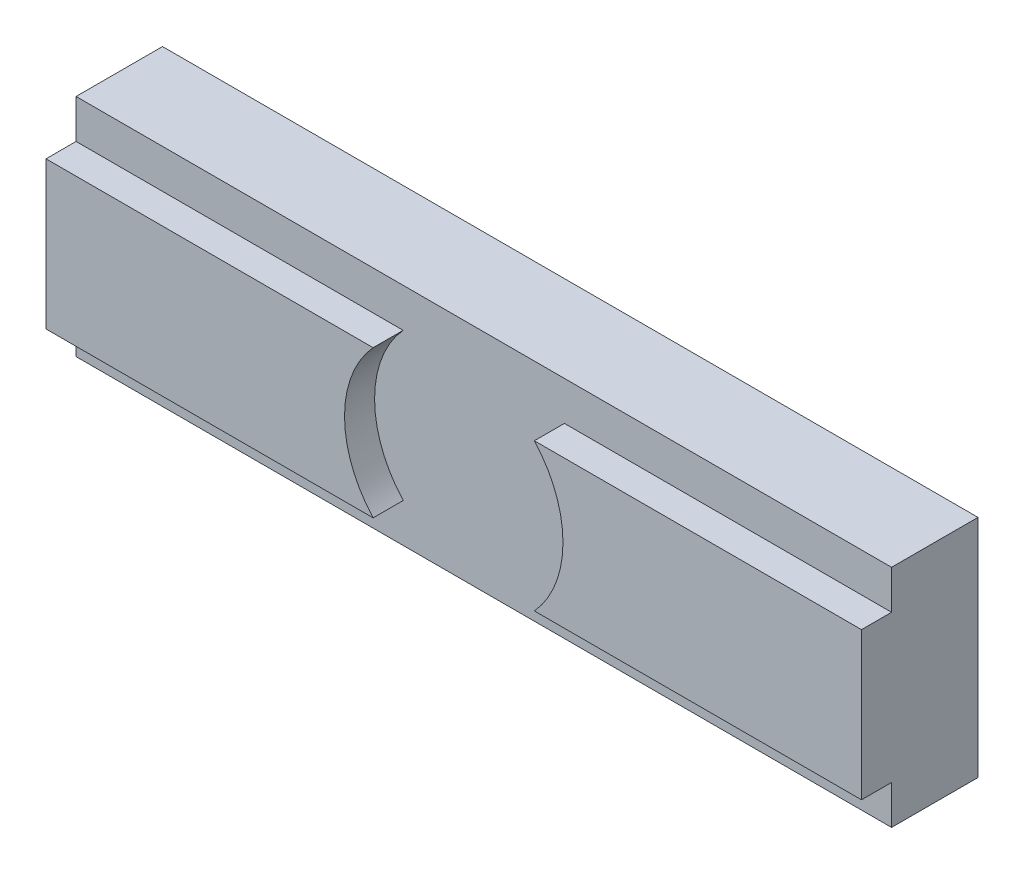
ISO-10303-21;
HEADER;
FILE_DESCRIPTION(('STEP AP214'),'2;1');
FILE_NAME('part.step','',(''),(''),'','','');
FILE_SCHEMA(('AUTOMOTIVE_DESIGN { 1 0 10303 214 1 1 1 1 }'));
ENDSEC;
DATA;
#1=APPLICATION_CONTEXT('core data for automotive mechanical design processes');
#2=APPLICATION_PROTOCOL_DEFINITION('international standard','automotive_design',2000,#1);
#3=PRODUCT_CONTEXT('',#1,'mechanical');
#4=PRODUCT('Part','Part','',(#3));
#5=PRODUCT_RELATED_PRODUCT_CATEGORY('part','',(#4));
#6=PRODUCT_DEFINITION_FORMATION('','',#4);
#7=PRODUCT_DEFINITION_CONTEXT('part definition',#1,'design');
#8=PRODUCT_DEFINITION('design','',#6,#7);
#9=PRODUCT_DEFINITION_SHAPE('','',#8);
#10=(LENGTH_UNIT() NAMED_UNIT(*) SI_UNIT(.MILLI.,.METRE.));
#11=(NAMED_UNIT(*) PLANE_ANGLE_UNIT() SI_UNIT($,.RADIAN.));
#12=(NAMED_UNIT(*) SI_UNIT($,.STERADIAN.) SOLID_ANGLE_UNIT());
#13=UNCERTAINTY_MEASURE_WITH_UNIT(LENGTH_MEASURE(1.E-05),#10,'distance_accuracy_value','');
#14=(GEOMETRIC_REPRESENTATION_CONTEXT(3) GLOBAL_UNCERTAINTY_ASSIGNED_CONTEXT((#13)) GLOBAL_UNIT_ASSIGNED_CONTEXT((#10,
#11,#12)) REPRESENTATION_CONTEXT('',''));
#15=CARTESIAN_POINT('',(0.,0.,0.));
#16=DIRECTION('',(0.,0.,1.));
#17=DIRECTION('',(1.,0.,0.));
#18=AXIS2_PLACEMENT_3D('',#15,#16,#17);
#19=CARTESIAN_POINT('',(140.,-12.6506155685339,0.));
#20=DIRECTION('',(0.,1.,0.));
#21=DIRECTION('',(0.,0.,1.));
#22=AXIS2_PLACEMENT_3D('',#19,#20,#21);
#23=PLANE('',#22);
#24=DIRECTION('',(-1.,0.,0.));
#25=VECTOR('',#24,1.);
#26=CARTESIAN_POINT('',(140.,-12.6506155685339,4.83999999998367));
#27=LINE('',#26,#25);
#28=CARTESIAN_POINT('',(56.1607649872846,-12.6506155685339,4.83999999998367));
#29=VERTEX_POINT('',#28);
#30=CARTESIAN_POINT('',(0.,-12.6506155685339,4.83999999998367));
#31=VERTEX_POINT('',#30);
#32=EDGE_CURVE('E187',#29,#31,#27,.T.);
#33=ORIENTED_EDGE('',*,*,#32,.F.);
#34=DIRECTION('',(0.,0.,1.));
#35=VECTOR('',#34,1.);
#36=CARTESIAN_POINT('',(56.1607649872846,-12.6506155685339,-48.1930085890074));
#37=LINE('',#36,#35);
#38=CARTESIAN_POINT('',(56.1607649872846,-12.6506155685339,10.));
#39=VERTEX_POINT('',#38);
#40=EDGE_CURVE('E159',#29,#39,#37,.T.);
#41=ORIENTED_EDGE('',*,*,#40,.T.);
#42=DIRECTION('',(-1.,0.,0.));
#43=VECTOR('',#42,1.);
#44=CARTESIAN_POINT('',(140.,-12.6506155685339,10.));
#45=LINE('',#44,#43);
#46=CARTESIAN_POINT('',(0.,-12.6506155685339,10.));
#47=VERTEX_POINT('',#46);
#48=EDGE_CURVE('E99',#39,#47,#45,.T.);
#49=ORIENTED_EDGE('',*,*,#48,.T.);
#50=DIRECTION('',(0.,0.,-1.));
#51=VECTOR('',#50,1.);
#52=CARTESIAN_POINT('',(0.,-12.6506155685339,0.));
#53=LINE('',#52,#51);
#54=EDGE_CURVE('E160',#47,#31,#53,.T.);
#55=ORIENTED_EDGE('',*,*,#54,.T.);
#56=EDGE_LOOP('',(#33,#41,#49,#55));
#57=FACE_BOUND('',#56,.T.);
#58=ADVANCED_FACE('F41',(#57),#23,.F.);
#59=CARTESIAN_POINT('',(140.,12.6506155685339,0.));
#60=DIRECTION('',(0.,1.,0.));
#61=DIRECTION('',(0.,0.,1.));
#62=AXIS2_PLACEMENT_3D('',#59,#60,#61);
#63=PLANE('',#62);
#64=DIRECTION('',(0.,0.,1.));
#65=VECTOR('',#64,1.);
#66=CARTESIAN_POINT('',(56.1607649872846,12.6506155685339,-48.1930085890074));
#67=LINE('',#66,#65);
#68=CARTESIAN_POINT('',(56.1607649872846,12.6506155685339,4.83999999998367));
#69=VERTEX_POINT('',#68);
#70=CARTESIAN_POINT('',(56.1607649872846,12.6506155685339,10.));
#71=VERTEX_POINT('',#70);
#72=EDGE_CURVE('E204',#69,#71,#67,.T.);
#73=ORIENTED_EDGE('',*,*,#72,.F.);
#74=DIRECTION('',(-1.,0.,0.));
#75=VECTOR('',#74,1.);
#76=CARTESIAN_POINT('',(140.,12.6506155685339,4.83999999998367));
#77=LINE('',#76,#75);
#78=CARTESIAN_POINT('',(0.,12.6506155685339,4.83999999998367));
#79=VERTEX_POINT('',#78);
#80=EDGE_CURVE('E140',#69,#79,#77,.T.);
#81=ORIENTED_EDGE('',*,*,#80,.T.);
#82=DIRECTION('',(0.,0.,-1.));
#83=VECTOR('',#82,1.);
#84=CARTESIAN_POINT('',(0.,12.6506155685339,0.));
#85=LINE('',#84,#83);
#86=CARTESIAN_POINT('',(0.,12.6506155685339,10.));
#87=VERTEX_POINT('',#86);
#88=EDGE_CURVE('E171',#87,#79,#85,.T.);
#89=ORIENTED_EDGE('',*,*,#88,.F.);
#90=DIRECTION('',(-1.,0.,0.));
#91=VECTOR('',#90,1.);
#92=CARTESIAN_POINT('',(140.,12.6506155685339,10.));
#93=LINE('',#92,#91);
#94=EDGE_CURVE('E182',#71,#87,#93,.T.);
#95=ORIENTED_EDGE('',*,*,#94,.F.);
#96=EDGE_LOOP('',(#73,#81,#89,#95));
#97=FACE_BOUND('',#96,.T.);
#98=ADVANCED_FACE('F229',(#97),#63,.T.);
#99=CARTESIAN_POINT('',(140.,0.,10.));
#100=DIRECTION('',(0.,0.,1.));
#101=DIRECTION('',(1.,0.,0.));
#102=AXIS2_PLACEMENT_3D('',#99,#100,#101);
#103=PLANE('',#102);
#104=CARTESIAN_POINT('',(70.,0.,10.));
#105=DIRECTION('',(0.,0.,1.));
#106=DIRECTION('',(1.,0.,0.));
#107=AXIS2_PLACEMENT_3D('',#104,#105,#106);
#108=CIRCLE('',#107,18.75);
#109=EDGE_CURVE('E11',#71,#39,#108,.T.);
#110=ORIENTED_EDGE('',*,*,#109,.F.);
#111=ORIENTED_EDGE('',*,*,#94,.T.);
#112=DIRECTION('',(0.,1.,0.));
#113=VECTOR('',#112,1.);
#114=CARTESIAN_POINT('',(0.,0.,10.));
#115=LINE('',#114,#113);
#116=EDGE_CURVE('E179',#47,#87,#115,.T.);
#117=ORIENTED_EDGE('',*,*,#116,.F.);
#118=ORIENTED_EDGE('',*,*,#48,.F.);
#119=EDGE_LOOP('',(#110,#111,#117,#118));
#120=FACE_BOUND('',#119,.T.);
#121=ADVANCED_FACE('F243',(#120),#103,.T.);
#122=CARTESIAN_POINT('',(140.,-12.6506155685339,10.));
#123=VERTEX_POINT('',#122);
#124=CARTESIAN_POINT('',(83.8392350127154,-12.6506155685339,10.));
#125=VERTEX_POINT('',#124);
#126=EDGE_CURVE('E62',#123,#125,#45,.T.);
#127=ORIENTED_EDGE('',*,*,#126,.T.);
#128=DIRECTION('',(0.,0.,1.));
#129=VECTOR('',#128,1.);
#130=CARTESIAN_POINT('',(83.8392350127154,-12.6506155685339,-48.1930085890074));
#131=LINE('',#130,#129);
#132=CARTESIAN_POINT('',(83.8392350127154,-12.6506155685339,4.83999999998367));
#133=VERTEX_POINT('',#132);
#134=EDGE_CURVE('E210',#125,#133,#131,.F.);
#135=ORIENTED_EDGE('',*,*,#134,.T.);
#136=CARTESIAN_POINT('',(140.,-12.6506155685339,4.83999999998367));
#137=VERTEX_POINT('',#136);
#138=EDGE_CURVE('E44',#137,#133,#27,.T.);
#139=ORIENTED_EDGE('',*,*,#138,.F.);
#140=DIRECTION('',(0.,0.,-1.));
#141=VECTOR('',#140,1.);
#142=CARTESIAN_POINT('',(140.,-12.6506155685339,0.));
#143=LINE('',#142,#141);
#144=EDGE_CURVE('E178',#123,#137,#143,.T.);
#145=ORIENTED_EDGE('',*,*,#144,.F.);
#146=EDGE_LOOP('',(#127,#135,#139,#145));
#147=FACE_BOUND('',#146,.T.);
#148=ADVANCED_FACE('F43',(#147),#23,.F.);
#149=CARTESIAN_POINT('',(140.,-19.34,0.));
#150=DIRECTION('',(0.,1.,0.));
#151=DIRECTION('',(0.,0.,1.));
#152=AXIS2_PLACEMENT_3D('',#149,#150,#151);
#153=PLANE('',#152);
#154=DIRECTION('',(0.,0.,-1.));
#155=VECTOR('',#154,1.);
#156=CARTESIAN_POINT('',(0.,-19.34,0.));
#157=LINE('',#156,#155);
#158=CARTESIAN_POINT('',(0.,-19.34,4.83999999998367));
#159=VERTEX_POINT('',#158);
#160=CARTESIAN_POINT('',(0.,-19.34,-10.));
#161=VERTEX_POINT('',#160);
#162=EDGE_CURVE('E165',#159,#161,#157,.T.);
#163=ORIENTED_EDGE('',*,*,#162,.T.);
#164=DIRECTION('',(-1.,0.,0.));
#165=VECTOR('',#164,1.);
#166=CARTESIAN_POINT('',(140.,-19.34,-10.));
#167=LINE('',#166,#165);
#168=CARTESIAN_POINT('',(140.,-19.34,-10.));
#169=VERTEX_POINT('',#168);
#170=EDGE_CURVE('E188',#169,#161,#167,.T.);
#171=ORIENTED_EDGE('',*,*,#170,.F.);
#172=DIRECTION('',(0.,0.,-1.));
#173=VECTOR('',#172,1.);
#174=CARTESIAN_POINT('',(140.,-19.34,0.));
#175=LINE('',#174,#173);
#176=CARTESIAN_POINT('',(140.,-19.34,4.83999999998367));
#177=VERTEX_POINT('',#176);
#178=EDGE_CURVE('E213',#177,#169,#175,.T.);
#179=ORIENTED_EDGE('',*,*,#178,.F.);
#180=DIRECTION('',(-1.,0.,0.));
#181=VECTOR('',#180,1.);
#182=CARTESIAN_POINT('',(140.,-19.34,4.83999999998367));
#183=LINE('',#182,#181);
#184=EDGE_CURVE('E186',#177,#159,#183,.T.);
#185=ORIENTED_EDGE('',*,*,#184,.T.);
#186=EDGE_LOOP('',(#163,#171,#179,#185));
#187=FACE_BOUND('',#186,.T.);
#188=ADVANCED_FACE('F264',(#187),#153,.F.);
#189=CARTESIAN_POINT('',(140.,0.,-10.));
#190=DIRECTION('',(0.,0.,1.));
#191=DIRECTION('',(0.,-1.,0.));
#192=AXIS2_PLACEMENT_3D('',#189,#190,#191);
#193=PLANE('',#192);
#194=DIRECTION('',(0.,1.,0.));
#195=VECTOR('',#194,1.);
#196=CARTESIAN_POINT('',(0.,0.,-10.));
#197=LINE('',#196,#195);
#198=CARTESIAN_POINT('',(0.,19.34,-10.));
#199=VERTEX_POINT('',#198);
#200=EDGE_CURVE('E163',#161,#199,#197,.T.);
#201=ORIENTED_EDGE('',*,*,#200,.T.);
#202=DIRECTION('',(-1.,0.,0.));
#203=VECTOR('',#202,1.);
#204=CARTESIAN_POINT('',(140.,19.34,-10.));
#205=LINE('',#204,#203);
#206=CARTESIAN_POINT('',(140.,19.34,-10.));
#207=VERTEX_POINT('',#206);
#208=EDGE_CURVE('E184',#207,#199,#205,.T.);
#209=ORIENTED_EDGE('',*,*,#208,.F.);
#210=DIRECTION('',(0.,1.,0.));
#211=VECTOR('',#210,1.);
#212=CARTESIAN_POINT('',(140.,0.,-10.));
#213=LINE('',#212,#211);
#214=EDGE_CURVE('E214',#169,#207,#213,.T.);
#215=ORIENTED_EDGE('',*,*,#214,.F.);
#216=ORIENTED_EDGE('',*,*,#170,.T.);
#217=EDGE_LOOP('',(#201,#209,#215,#216));
#218=FACE_BOUND('',#217,.T.);
#219=ADVANCED_FACE('F269',(#218),#193,.F.);
#220=CARTESIAN_POINT('',(140.,19.34,0.));
#221=DIRECTION('',(0.,1.,0.));
#222=DIRECTION('',(0.,0.,1.));
#223=AXIS2_PLACEMENT_3D('',#220,#221,#222);
#224=PLANE('',#223);
#225=DIRECTION('',(0.,0.,-1.));
#226=VECTOR('',#225,1.);
#227=CARTESIAN_POINT('',(0.,19.34,0.));
#228=LINE('',#227,#226);
#229=CARTESIAN_POINT('',(0.,19.34,4.83999999998367));
#230=VERTEX_POINT('',#229);
#231=EDGE_CURVE('E170',#230,#199,#228,.T.);
#232=ORIENTED_EDGE('',*,*,#231,.F.);
#233=DIRECTION('',(-1.,0.,0.));
#234=VECTOR('',#233,1.);
#235=CARTESIAN_POINT('',(140.,19.34,4.83999999998367));
#236=LINE('',#235,#234);
#237=CARTESIAN_POINT('',(140.,19.34,4.83999999998367));
#238=VERTEX_POINT('',#237);
#239=EDGE_CURVE('E136',#238,#230,#236,.T.);
#240=ORIENTED_EDGE('',*,*,#239,.F.);
#241=DIRECTION('',(0.,0.,-1.));
#242=VECTOR('',#241,1.);
#243=CARTESIAN_POINT('',(140.,19.34,0.));
#244=LINE('',#243,#242);
#245=EDGE_CURVE('E150',#238,#207,#244,.T.);
#246=ORIENTED_EDGE('',*,*,#245,.T.);
#247=ORIENTED_EDGE('',*,*,#208,.T.);
#248=EDGE_LOOP('',(#232,#240,#246,#247));
#249=FACE_BOUND('',#248,.T.);
#250=ADVANCED_FACE('F217',(#249),#224,.T.);
#251=CARTESIAN_POINT('',(140.,0.,4.83999999998367));
#252=DIRECTION('',(0.,0.,1.));
#253=DIRECTION('',(1.,0.,0.));
#254=AXIS2_PLACEMENT_3D('',#251,#252,#253);
#255=PLANE('',#254);
#256=ORIENTED_EDGE('',*,*,#80,.F.);
#257=CARTESIAN_POINT('',(70.,0.,4.83999999998367));
#258=DIRECTION('',(0.,0.,1.));
#259=DIRECTION('',(1.,0.,0.));
#260=AXIS2_PLACEMENT_3D('',#257,#258,#259);
#261=CIRCLE('',#260,18.75);
#262=EDGE_CURVE('E203',#29,#69,#261,.F.);
#263=ORIENTED_EDGE('',*,*,#262,.F.);
#264=ORIENTED_EDGE('',*,*,#32,.T.);
#265=DIRECTION('',(0.,-1.,0.));
#266=VECTOR('',#265,1.);
#267=CARTESIAN_POINT('',(0.,0.,4.83999999998367));
#268=LINE('',#267,#266);
#269=EDGE_CURVE('E157',#31,#159,#268,.T.);
#270=ORIENTED_EDGE('',*,*,#269,.T.);
#271=ORIENTED_EDGE('',*,*,#184,.F.);
#272=DIRECTION('',(0.,-1.,0.));
#273=VECTOR('',#272,1.);
#274=CARTESIAN_POINT('',(140.,0.,4.83999999998367));
#275=LINE('',#274,#273);
#276=EDGE_CURVE('E108',#137,#177,#275,.T.);
#277=ORIENTED_EDGE('',*,*,#276,.F.);
#278=ORIENTED_EDGE('',*,*,#138,.T.);
#279=CARTESIAN_POINT('',(83.8392350127154,12.6506155685339,4.83999999998367));
#280=VERTEX_POINT('',#279);
#281=EDGE_CURVE('E134',#280,#133,#261,.F.);
#282=ORIENTED_EDGE('',*,*,#281,.F.);
#283=CARTESIAN_POINT('',(140.,12.6506155685339,4.83999999998367));
#284=VERTEX_POINT('',#283);
#285=EDGE_CURVE('E130',#284,#280,#77,.T.);
#286=ORIENTED_EDGE('',*,*,#285,.F.);
#287=DIRECTION('',(0.,1.,0.));
#288=VECTOR('',#287,1.);
#289=CARTESIAN_POINT('',(140.,0.,4.83999999998367));
#290=LINE('',#289,#288);
#291=EDGE_CURVE('E133',#284,#238,#290,.T.);
#292=ORIENTED_EDGE('',*,*,#291,.T.);
#293=ORIENTED_EDGE('',*,*,#239,.T.);
#294=DIRECTION('',(0.,1.,0.));
#295=VECTOR('',#294,1.);
#296=CARTESIAN_POINT('',(0.,0.,4.83999999998367));
#297=LINE('',#296,#295);
#298=EDGE_CURVE('E168',#79,#230,#297,.T.);
#299=ORIENTED_EDGE('',*,*,#298,.F.);
#300=EDGE_LOOP('',(#256,#263,#264,#270,#271,#277,#278,#282,#286,#292,#293,#299));
#301=FACE_BOUND('',#300,.T.);
#302=ADVANCED_FACE('F128',(#301),#255,.T.);
#303=DIRECTION('',(0.,0.,1.));
#304=VECTOR('',#303,1.);
#305=CARTESIAN_POINT('',(83.8392350127154,12.6506155685339,-48.1930085890074));
#306=LINE('',#305,#304);
#307=CARTESIAN_POINT('',(83.8392350127154,12.6506155685339,10.));
#308=VERTEX_POINT('',#307);
#309=EDGE_CURVE('E205',#308,#280,#306,.F.);
#310=ORIENTED_EDGE('',*,*,#309,.F.);
#311=CARTESIAN_POINT('',(140.,12.6506155685339,10.));
#312=VERTEX_POINT('',#311);
#313=EDGE_CURVE('E151',#312,#308,#93,.T.);
#314=ORIENTED_EDGE('',*,*,#313,.F.);
#315=DIRECTION('',(0.,0.,-1.));
#316=VECTOR('',#315,1.);
#317=CARTESIAN_POINT('',(140.,12.6506155685339,0.));
#318=LINE('',#317,#316);
#319=EDGE_CURVE('E144',#312,#284,#318,.T.);
#320=ORIENTED_EDGE('',*,*,#319,.T.);
#321=ORIENTED_EDGE('',*,*,#285,.T.);
#322=EDGE_LOOP('',(#310,#314,#320,#321));
#323=FACE_BOUND('',#322,.T.);
#324=ADVANCED_FACE('F149',(#323),#63,.T.);
#325=EDGE_CURVE('E49',#125,#308,#108,.T.);
#326=ORIENTED_EDGE('',*,*,#325,.F.);
#327=ORIENTED_EDGE('',*,*,#126,.F.);
#328=DIRECTION('',(0.,1.,0.));
#329=VECTOR('',#328,1.);
#330=CARTESIAN_POINT('',(140.,0.,10.));
#331=LINE('',#330,#329);
#332=EDGE_CURVE('E155',#123,#312,#331,.T.);
#333=ORIENTED_EDGE('',*,*,#332,.T.);
#334=ORIENTED_EDGE('',*,*,#313,.T.);
#335=EDGE_LOOP('',(#326,#327,#333,#334));
#336=FACE_BOUND('',#335,.T.);
#337=ADVANCED_FACE('F246',(#336),#103,.T.);
#338=CARTESIAN_POINT('',(140.,0.,0.));
#339=DIRECTION('',(1.,0.,0.));
#340=DIRECTION('',(0.,0.,-1.));
#341=AXIS2_PLACEMENT_3D('',#338,#339,#340);
#342=PLANE('',#341);
#343=ORIENTED_EDGE('',*,*,#144,.T.);
#344=ORIENTED_EDGE('',*,*,#276,.T.);
#345=ORIENTED_EDGE('',*,*,#178,.T.);
#346=ORIENTED_EDGE('',*,*,#214,.T.);
#347=ORIENTED_EDGE('',*,*,#245,.F.);
#348=ORIENTED_EDGE('',*,*,#291,.F.);
#349=ORIENTED_EDGE('',*,*,#319,.F.);
#350=ORIENTED_EDGE('',*,*,#332,.F.);
#351=EDGE_LOOP('',(#343,#344,#345,#346,#347,#348,#349,#350));
#352=FACE_BOUND('',#351,.T.);
#353=ADVANCED_FACE('F141',(#352),#342,.T.);
#354=CARTESIAN_POINT('',(0.,0.,0.));
#355=DIRECTION('',(1.,0.,0.));
#356=DIRECTION('',(0.,0.,-1.));
#357=AXIS2_PLACEMENT_3D('',#354,#355,#356);
#358=PLANE('',#357);
#359=ORIENTED_EDGE('',*,*,#54,.F.);
#360=ORIENTED_EDGE('',*,*,#116,.T.);
#361=ORIENTED_EDGE('',*,*,#88,.T.);
#362=ORIENTED_EDGE('',*,*,#298,.T.);
#363=ORIENTED_EDGE('',*,*,#231,.T.);
#364=ORIENTED_EDGE('',*,*,#200,.F.);
#365=ORIENTED_EDGE('',*,*,#162,.F.);
#366=ORIENTED_EDGE('',*,*,#269,.F.);
#367=EDGE_LOOP('',(#359,#360,#361,#362,#363,#364,#365,#366));
#368=FACE_BOUND('',#367,.T.);
#369=ADVANCED_FACE('F221',(#368),#358,.F.);
#370=CARTESIAN_POINT('',(70.,0.,-48.1930085890074));
#371=DIRECTION('',(0.,0.,1.));
#372=DIRECTION('',(1.,0.,0.));
#373=AXIS2_PLACEMENT_3D('',#370,#371,#372);
#374=CYLINDRICAL_SURFACE('',#373,18.75);
#375=ORIENTED_EDGE('',*,*,#262,.T.);
#376=ORIENTED_EDGE('',*,*,#72,.T.);
#377=ORIENTED_EDGE('',*,*,#109,.T.);
#378=ORIENTED_EDGE('',*,*,#40,.F.);
#379=EDGE_LOOP('',(#375,#376,#377,#378));
#380=FACE_BOUND('',#379,.T.);
#381=ADVANCED_FACE('F237',(#380),#374,.F.);
#382=ORIENTED_EDGE('',*,*,#325,.T.);
#383=ORIENTED_EDGE('',*,*,#309,.T.);
#384=ORIENTED_EDGE('',*,*,#281,.T.);
#385=ORIENTED_EDGE('',*,*,#134,.F.);
#386=EDGE_LOOP('',(#382,#383,#384,#385));
#387=FACE_BOUND('',#386,.T.);
#388=ADVANCED_FACE('F242',(#387),#374,.F.);
#389=CLOSED_SHELL('',(#58,#98,#121,#148,#188,#219,#250,#302,#324,#337,#353,#369,#381,#388));
#390=MANIFOLD_SOLID_BREP('B2',#389);
#391=ADVANCED_BREP_SHAPE_REPRESENTATION('',(#18,#390),#14);
#392=SHAPE_DEFINITION_REPRESENTATION(#9,#391);
ENDSEC;
END-ISO-10303-21;
